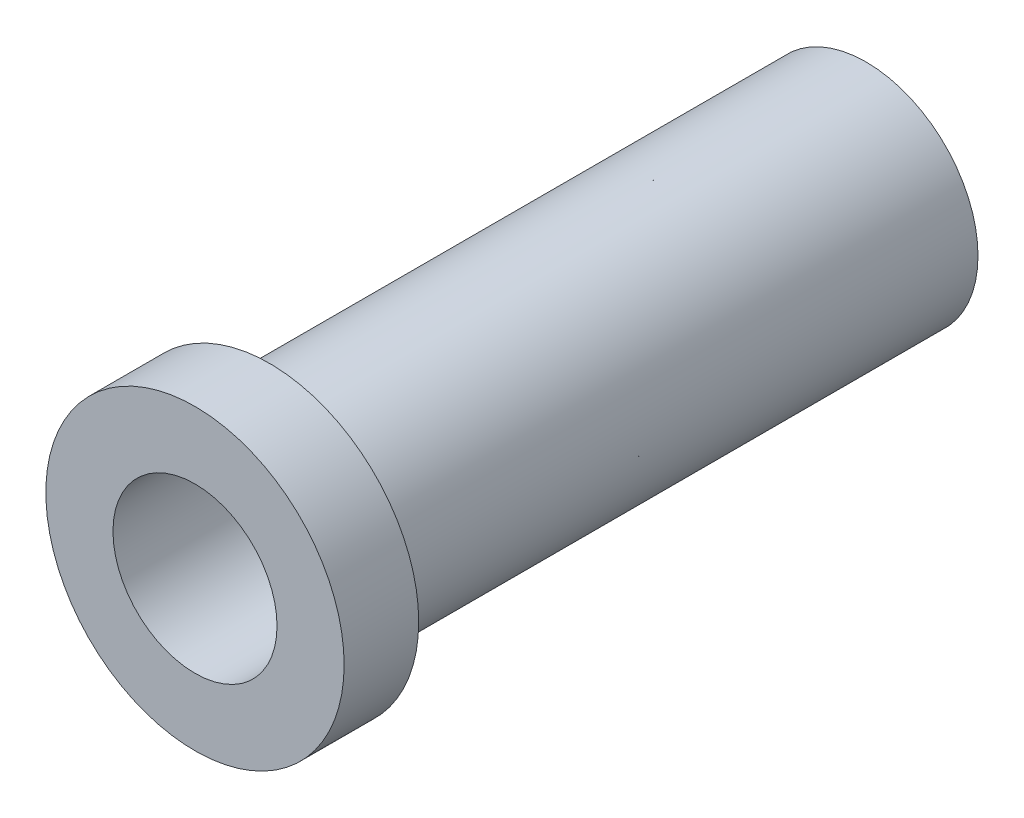
ISO-10303-21;
HEADER;
FILE_DESCRIPTION(('STEP AP214'),'2;1');
FILE_NAME('part.step','',(''),(''),'','','');
FILE_SCHEMA(('AUTOMOTIVE_DESIGN { 1 0 10303 214 1 1 1 1 }'));
ENDSEC;
DATA;
#1=APPLICATION_CONTEXT('core data for automotive mechanical design processes');
#2=APPLICATION_PROTOCOL_DEFINITION('international standard','automotive_design',2000,#1);
#3=PRODUCT_CONTEXT('',#1,'mechanical');
#4=PRODUCT('Part','Part','',(#3));
#5=PRODUCT_RELATED_PRODUCT_CATEGORY('part','',(#4));
#6=PRODUCT_DEFINITION_FORMATION('','',#4);
#7=PRODUCT_DEFINITION_CONTEXT('part definition',#1,'design');
#8=PRODUCT_DEFINITION('design','',#6,#7);
#9=PRODUCT_DEFINITION_SHAPE('','',#8);
#10=(LENGTH_UNIT() NAMED_UNIT(*) SI_UNIT(.MILLI.,.METRE.));
#11=(NAMED_UNIT(*) PLANE_ANGLE_UNIT() SI_UNIT($,.RADIAN.));
#12=(NAMED_UNIT(*) SI_UNIT($,.STERADIAN.) SOLID_ANGLE_UNIT());
#13=UNCERTAINTY_MEASURE_WITH_UNIT(LENGTH_MEASURE(1.E-05),#10,'distance_accuracy_value','');
#14=(GEOMETRIC_REPRESENTATION_CONTEXT(3) GLOBAL_UNCERTAINTY_ASSIGNED_CONTEXT((#13)) GLOBAL_UNIT_ASSIGNED_CONTEXT((#10,
#11,#12)) REPRESENTATION_CONTEXT('',''));
#15=CARTESIAN_POINT('',(0.,0.,0.));
#16=DIRECTION('',(0.,0.,1.));
#17=DIRECTION('',(1.,0.,0.));
#18=AXIS2_PLACEMENT_3D('',#15,#16,#17);
#19=CARTESIAN_POINT('',(0.,0.,0.));
#20=DIRECTION('',(0.,0.,1.));
#21=DIRECTION('',(1.,0.,0.));
#22=AXIS2_PLACEMENT_3D('',#19,#20,#21);
#23=PLANE('',#22);
#24=CARTESIAN_POINT('',(0.,0.,0.));
#25=DIRECTION('',(0.,0.,1.));
#26=DIRECTION('',(1.,0.,0.));
#27=AXIS2_PLACEMENT_3D('',#24,#25,#26);
#28=CIRCLE('',#27,10.);
#29=CARTESIAN_POINT('',(10.,0.,0.));
#30=VERTEX_POINT('',#29);
#31=EDGE_CURVE('E60',#30,#30,#28,.T.);
#32=ORIENTED_EDGE('',*,*,#31,.F.);
#33=EDGE_LOOP('',(#32));
#34=FACE_BOUND('',#33,.T.);
#35=CARTESIAN_POINT('',(0.,0.,0.));
#36=DIRECTION('',(0.,0.,1.));
#37=DIRECTION('',(1.,0.,0.));
#38=AXIS2_PLACEMENT_3D('',#35,#36,#37);
#39=CIRCLE('',#38,7.5);
#40=CARTESIAN_POINT('',(7.5,0.,0.));
#41=VERTEX_POINT('',#40);
#42=EDGE_CURVE('E11',#41,#41,#39,.F.);
#43=ORIENTED_EDGE('',*,*,#42,.F.);
#44=EDGE_LOOP('',(#43));
#45=FACE_BOUND('',#44,.T.);
#46=ADVANCED_FACE('F47',(#34,#45),#23,.F.);
#47=CARTESIAN_POINT('',(0.,0.,5.));
#48=DIRECTION('',(0.,0.,1.));
#49=DIRECTION('',(1.,0.,0.));
#50=AXIS2_PLACEMENT_3D('',#47,#48,#49);
#51=PLANE('',#50);
#52=CARTESIAN_POINT('',(0.,0.,5.));
#53=DIRECTION('',(0.,0.,1.));
#54=DIRECTION('',(1.,0.,0.));
#55=AXIS2_PLACEMENT_3D('',#52,#53,#54);
#56=CIRCLE('',#55,10.);
#57=CARTESIAN_POINT('',(10.,0.,5.));
#58=VERTEX_POINT('',#57);
#59=EDGE_CURVE('E55',#58,#58,#56,.T.);
#60=ORIENTED_EDGE('',*,*,#59,.T.);
#61=EDGE_LOOP('',(#60));
#62=FACE_BOUND('',#61,.T.);
#63=CARTESIAN_POINT('',(0.,0.,5.));
#64=DIRECTION('',(0.,0.,1.));
#65=DIRECTION('',(1.,0.,0.));
#66=AXIS2_PLACEMENT_3D('',#63,#64,#65);
#67=CIRCLE('',#66,5.5);
#68=CARTESIAN_POINT('',(5.5,0.,5.));
#69=VERTEX_POINT('',#68);
#70=EDGE_CURVE('E66',#69,#69,#67,.T.);
#71=ORIENTED_EDGE('',*,*,#70,.F.);
#72=EDGE_LOOP('',(#71));
#73=FACE_BOUND('',#72,.T.);
#74=ADVANCED_FACE('F96',(#62,#73),#51,.T.);
#75=CARTESIAN_POINT('',(0.,0.,5.));
#76=DIRECTION('',(0.,0.,-1.));
#77=DIRECTION('',(-1.,0.,0.));
#78=AXIS2_PLACEMENT_3D('',#75,#76,#77);
#79=CYLINDRICAL_SURFACE('',#78,10.);
#80=ORIENTED_EDGE('',*,*,#59,.F.);
#81=EDGE_LOOP('',(#80));
#82=FACE_BOUND('',#81,.T.);
#83=ORIENTED_EDGE('',*,*,#31,.T.);
#84=EDGE_LOOP('',(#83));
#85=FACE_BOUND('',#84,.T.);
#86=ADVANCED_FACE('F49',(#82,#85),#79,.T.);
#87=CARTESIAN_POINT('',(0.,0.,5.));
#88=DIRECTION('',(0.,0.,-1.));
#89=DIRECTION('',(-1.,0.,0.));
#90=AXIS2_PLACEMENT_3D('',#87,#88,#89);
#91=CYLINDRICAL_SURFACE('',#90,5.5);
#92=ORIENTED_EDGE('',*,*,#70,.T.);
#93=EDGE_LOOP('',(#92));
#94=FACE_BOUND('',#93,.T.);
#95=CARTESIAN_POINT('',(0.,0.,-40.));
#96=DIRECTION('',(0.,0.,-1.));
#97=DIRECTION('',(-1.,0.,0.));
#98=AXIS2_PLACEMENT_3D('',#95,#96,#97);
#99=CIRCLE('',#98,5.5);
#100=CARTESIAN_POINT('',(-5.5,0.,-40.));
#101=VERTEX_POINT('',#100);
#102=EDGE_CURVE('E75',#101,#101,#99,.T.);
#103=ORIENTED_EDGE('',*,*,#102,.T.);
#104=EDGE_LOOP('',(#103));
#105=FACE_BOUND('',#104,.T.);
#106=ADVANCED_FACE('F80',(#94,#105),#91,.F.);
#107=CARTESIAN_POINT('',(0.,0.,-40.));
#108=DIRECTION('',(0.,0.,-1.));
#109=DIRECTION('',(-1.,0.,0.));
#110=AXIS2_PLACEMENT_3D('',#107,#108,#109);
#111=PLANE('',#110);
#112=CARTESIAN_POINT('',(0.,0.,-40.));
#113=DIRECTION('',(0.,0.,-1.));
#114=DIRECTION('',(-1.,0.,0.));
#115=AXIS2_PLACEMENT_3D('',#112,#113,#114);
#116=CIRCLE('',#115,7.5);
#117=CARTESIAN_POINT('',(-7.5,0.,-40.));
#118=VERTEX_POINT('',#117);
#119=EDGE_CURVE('E71',#118,#118,#116,.T.);
#120=ORIENTED_EDGE('',*,*,#119,.T.);
#121=EDGE_LOOP('',(#120));
#122=FACE_BOUND('',#121,.T.);
#123=ORIENTED_EDGE('',*,*,#102,.F.);
#124=EDGE_LOOP('',(#123));
#125=FACE_BOUND('',#124,.T.);
#126=ADVANCED_FACE('F82',(#122,#125),#111,.T.);
#127=CARTESIAN_POINT('',(0.,0.,-40.));
#128=DIRECTION('',(0.,0.,1.));
#129=DIRECTION('',(1.,0.,0.));
#130=AXIS2_PLACEMENT_3D('',#127,#128,#129);
#131=CYLINDRICAL_SURFACE('',#130,7.5);
#132=ORIENTED_EDGE('',*,*,#119,.F.);
#133=EDGE_LOOP('',(#132));
#134=FACE_BOUND('',#133,.T.);
#135=ORIENTED_EDGE('',*,*,#42,.T.);
#136=EDGE_LOOP('',(#135));
#137=FACE_BOUND('',#136,.T.);
#138=ADVANCED_FACE('F84',(#134,#137),#131,.T.);
#139=CLOSED_SHELL('',(#46,#74,#86,#106,#126,#138));
#140=MANIFOLD_SOLID_BREP('B2',#139);
#141=ADVANCED_BREP_SHAPE_REPRESENTATION('',(#18,#140),#14);
#142=SHAPE_DEFINITION_REPRESENTATION(#9,#141);
ENDSEC;
END-ISO-10303-21;
